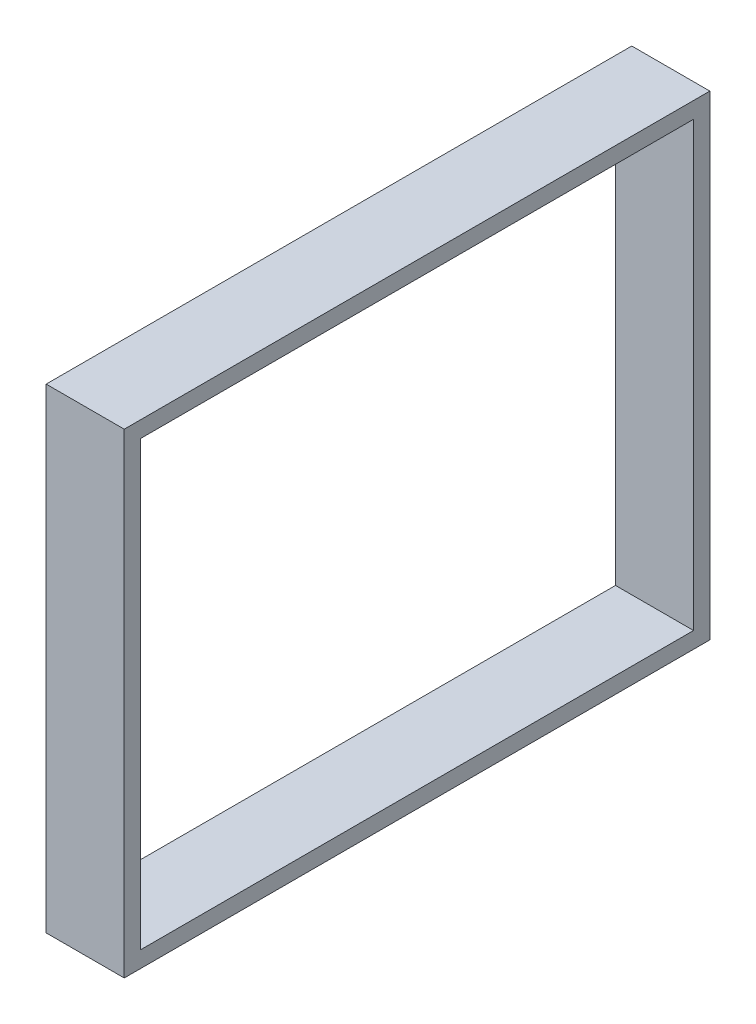
ISO-10303-21;
HEADER;
FILE_DESCRIPTION(('STEP AP214'),'2;1');
FILE_NAME('part.step','',(''),(''),'','','');
FILE_SCHEMA(('AUTOMOTIVE_DESIGN { 1 0 10303 214 1 1 1 1 }'));
ENDSEC;
DATA;
#1=APPLICATION_CONTEXT('core data for automotive mechanical design processes');
#2=APPLICATION_PROTOCOL_DEFINITION('international standard','automotive_design',2000,#1);
#3=PRODUCT_CONTEXT('',#1,'mechanical');
#4=PRODUCT('Part','Part','',(#3));
#5=PRODUCT_RELATED_PRODUCT_CATEGORY('part','',(#4));
#6=PRODUCT_DEFINITION_FORMATION('','',#4);
#7=PRODUCT_DEFINITION_CONTEXT('part definition',#1,'design');
#8=PRODUCT_DEFINITION('design','',#6,#7);
#9=PRODUCT_DEFINITION_SHAPE('','',#8);
#10=(LENGTH_UNIT() NAMED_UNIT(*) SI_UNIT(.MILLI.,.METRE.));
#11=(NAMED_UNIT(*) PLANE_ANGLE_UNIT() SI_UNIT($,.RADIAN.));
#12=(NAMED_UNIT(*) SI_UNIT($,.STERADIAN.) SOLID_ANGLE_UNIT());
#13=UNCERTAINTY_MEASURE_WITH_UNIT(LENGTH_MEASURE(1.E-05),#10,'distance_accuracy_value','');
#14=(GEOMETRIC_REPRESENTATION_CONTEXT(3) GLOBAL_UNCERTAINTY_ASSIGNED_CONTEXT((#13)) GLOBAL_UNIT_ASSIGNED_CONTEXT((#10,
#11,#12)) REPRESENTATION_CONTEXT('',''));
#15=CARTESIAN_POINT('',(0.,0.,0.));
#16=DIRECTION('',(0.,0.,1.));
#17=DIRECTION('',(1.,0.,0.));
#18=AXIS2_PLACEMENT_3D('',#15,#16,#17);
#19=CARTESIAN_POINT('',(2.4,0.,0.));
#20=DIRECTION('',(1.,0.,0.));
#21=DIRECTION('',(0.,0.,-1.));
#22=AXIS2_PLACEMENT_3D('',#19,#20,#21);
#23=PLANE('',#22);
#24=DIRECTION('',(0.,0.,-1.));
#25=VECTOR('',#24,1.);
#26=CARTESIAN_POINT('',(2.4,67.55,18.));
#27=LINE('',#26,#25);
#28=CARTESIAN_POINT('',(2.4,67.55,18.));
#29=VERTEX_POINT('',#28);
#30=CARTESIAN_POINT('',(2.4,67.55,-18.));
#31=VERTEX_POINT('',#30);
#32=EDGE_CURVE('E145',#29,#31,#27,.T.);
#33=ORIENTED_EDGE('',*,*,#32,.T.);
#34=DIRECTION('',(0.,1.,0.));
#35=VECTOR('',#34,1.);
#36=CARTESIAN_POINT('',(2.4,67.55,-18.));
#37=LINE('',#36,#35);
#38=CARTESIAN_POINT('',(2.4,96.77,-18.));
#39=VERTEX_POINT('',#38);
#40=EDGE_CURVE('E144',#31,#39,#37,.T.);
#41=ORIENTED_EDGE('',*,*,#40,.T.);
#42=DIRECTION('',(0.,0.,1.));
#43=VECTOR('',#42,1.);
#44=CARTESIAN_POINT('',(2.4,96.77,-18.));
#45=LINE('',#44,#43);
#46=CARTESIAN_POINT('',(2.4,96.77,18.));
#47=VERTEX_POINT('',#46);
#48=EDGE_CURVE('E149',#39,#47,#45,.T.);
#49=ORIENTED_EDGE('',*,*,#48,.T.);
#50=DIRECTION('',(0.,-1.,0.));
#51=VECTOR('',#50,1.);
#52=CARTESIAN_POINT('',(2.4,96.77,18.));
#53=LINE('',#52,#51);
#54=EDGE_CURVE('E148',#47,#29,#53,.T.);
#55=ORIENTED_EDGE('',*,*,#54,.T.);
#56=EDGE_LOOP('',(#33,#41,#49,#55));
#57=FACE_BOUND('',#56,.T.);
#58=DIRECTION('',(0.,1.,0.));
#59=VECTOR('',#58,1.);
#60=CARTESIAN_POINT('',(2.4,68.55,-17.));
#61=LINE('',#60,#59);
#62=CARTESIAN_POINT('',(2.4,68.55,-17.));
#63=VERTEX_POINT('',#62);
#64=CARTESIAN_POINT('',(2.4,95.77,-17.));
#65=VERTEX_POINT('',#64);
#66=EDGE_CURVE('E114',#63,#65,#61,.T.);
#67=ORIENTED_EDGE('',*,*,#66,.F.);
#68=DIRECTION('',(0.,0.,-1.));
#69=VECTOR('',#68,1.);
#70=CARTESIAN_POINT('',(2.4,68.55,17.));
#71=LINE('',#70,#69);
#72=CARTESIAN_POINT('',(2.4,68.55,17.));
#73=VERTEX_POINT('',#72);
#74=EDGE_CURVE('E107',#73,#63,#71,.T.);
#75=ORIENTED_EDGE('',*,*,#74,.F.);
#76=DIRECTION('',(0.,-1.,0.));
#77=VECTOR('',#76,1.);
#78=CARTESIAN_POINT('',(2.4,95.77,17.));
#79=LINE('',#78,#77);
#80=CARTESIAN_POINT('',(2.4,95.77,17.));
#81=VERTEX_POINT('',#80);
#82=EDGE_CURVE('E126',#81,#73,#79,.T.);
#83=ORIENTED_EDGE('',*,*,#82,.F.);
#84=DIRECTION('',(0.,0.,1.));
#85=VECTOR('',#84,1.);
#86=CARTESIAN_POINT('',(2.4,95.77,-17.));
#87=LINE('',#86,#85);
#88=EDGE_CURVE('E128',#65,#81,#87,.T.);
#89=ORIENTED_EDGE('',*,*,#88,.F.);
#90=EDGE_LOOP('',(#67,#75,#83,#89));
#91=FACE_BOUND('',#90,.T.);
#92=ADVANCED_FACE('F41',(#57,#91),#23,.T.);
#93=CARTESIAN_POINT('',(-2.4,0.,0.));
#94=DIRECTION('',(1.,0.,0.));
#95=DIRECTION('',(0.,0.,-1.));
#96=AXIS2_PLACEMENT_3D('',#93,#94,#95);
#97=PLANE('',#96);
#98=DIRECTION('',(0.,0.,-1.));
#99=VECTOR('',#98,1.);
#100=CARTESIAN_POINT('',(-2.4,67.55,18.));
#101=LINE('',#100,#99);
#102=CARTESIAN_POINT('',(-2.4,67.55,18.));
#103=VERTEX_POINT('',#102);
#104=CARTESIAN_POINT('',(-2.4,67.55,-18.));
#105=VERTEX_POINT('',#104);
#106=EDGE_CURVE('E122',#103,#105,#101,.T.);
#107=ORIENTED_EDGE('',*,*,#106,.F.);
#108=DIRECTION('',(0.,-1.,0.));
#109=VECTOR('',#108,1.);
#110=CARTESIAN_POINT('',(-2.4,96.77,18.));
#111=LINE('',#110,#109);
#112=CARTESIAN_POINT('',(-2.4,96.77,18.));
#113=VERTEX_POINT('',#112);
#114=EDGE_CURVE('E147',#113,#103,#111,.T.);
#115=ORIENTED_EDGE('',*,*,#114,.F.);
#116=DIRECTION('',(0.,0.,1.));
#117=VECTOR('',#116,1.);
#118=CARTESIAN_POINT('',(-2.4,96.77,-18.));
#119=LINE('',#118,#117);
#120=CARTESIAN_POINT('',(-2.4,96.77,-18.));
#121=VERTEX_POINT('',#120);
#122=EDGE_CURVE('E160',#121,#113,#119,.T.);
#123=ORIENTED_EDGE('',*,*,#122,.F.);
#124=DIRECTION('',(0.,1.,0.));
#125=VECTOR('',#124,1.);
#126=CARTESIAN_POINT('',(-2.4,67.55,-18.));
#127=LINE('',#126,#125);
#128=EDGE_CURVE('E151',#105,#121,#127,.T.);
#129=ORIENTED_EDGE('',*,*,#128,.F.);
#130=EDGE_LOOP('',(#107,#115,#123,#129));
#131=FACE_BOUND('',#130,.T.);
#132=DIRECTION('',(0.,0.,-1.));
#133=VECTOR('',#132,1.);
#134=CARTESIAN_POINT('',(-2.4,68.55,17.));
#135=LINE('',#134,#133);
#136=CARTESIAN_POINT('',(-2.4,68.55,17.));
#137=VERTEX_POINT('',#136);
#138=CARTESIAN_POINT('',(-2.4,68.55,-17.));
#139=VERTEX_POINT('',#138);
#140=EDGE_CURVE('E64',#137,#139,#135,.T.);
#141=ORIENTED_EDGE('',*,*,#140,.T.);
#142=DIRECTION('',(0.,1.,0.));
#143=VECTOR('',#142,1.);
#144=CARTESIAN_POINT('',(-2.4,68.55,-17.));
#145=LINE('',#144,#143);
#146=CARTESIAN_POINT('',(-2.4,95.77,-17.));
#147=VERTEX_POINT('',#146);
#148=EDGE_CURVE('E123',#139,#147,#145,.T.);
#149=ORIENTED_EDGE('',*,*,#148,.T.);
#150=DIRECTION('',(0.,0.,1.));
#151=VECTOR('',#150,1.);
#152=CARTESIAN_POINT('',(-2.4,95.77,-17.));
#153=LINE('',#152,#151);
#154=CARTESIAN_POINT('',(-2.4,95.77,17.));
#155=VERTEX_POINT('',#154);
#156=EDGE_CURVE('E132',#147,#155,#153,.T.);
#157=ORIENTED_EDGE('',*,*,#156,.T.);
#158=DIRECTION('',(0.,-1.,0.));
#159=VECTOR('',#158,1.);
#160=CARTESIAN_POINT('',(-2.4,95.77,17.));
#161=LINE('',#160,#159);
#162=EDGE_CURVE('E113',#155,#137,#161,.T.);
#163=ORIENTED_EDGE('',*,*,#162,.T.);
#164=EDGE_LOOP('',(#141,#149,#157,#163));
#165=FACE_BOUND('',#164,.T.);
#166=ADVANCED_FACE('F172',(#131,#165),#97,.F.);
#167=CARTESIAN_POINT('',(2.4,67.55,18.));
#168=DIRECTION('',(0.,1.,0.));
#169=DIRECTION('',(0.,0.,1.));
#170=AXIS2_PLACEMENT_3D('',#167,#168,#169);
#171=PLANE('',#170);
#172=ORIENTED_EDGE('',*,*,#106,.T.);
#173=DIRECTION('',(-1.,0.,0.));
#174=VECTOR('',#173,1.);
#175=CARTESIAN_POINT('',(2.4,67.55,-18.));
#176=LINE('',#175,#174);
#177=EDGE_CURVE('E11',#31,#105,#176,.T.);
#178=ORIENTED_EDGE('',*,*,#177,.F.);
#179=ORIENTED_EDGE('',*,*,#32,.F.);
#180=DIRECTION('',(-1.,0.,0.));
#181=VECTOR('',#180,1.);
#182=CARTESIAN_POINT('',(2.4,67.55,18.));
#183=LINE('',#182,#181);
#184=EDGE_CURVE('E155',#29,#103,#183,.T.);
#185=ORIENTED_EDGE('',*,*,#184,.T.);
#186=EDGE_LOOP('',(#172,#178,#179,#185));
#187=FACE_BOUND('',#186,.T.);
#188=ADVANCED_FACE('F43',(#187),#171,.F.);
#189=CARTESIAN_POINT('',(2.4,67.55,-18.));
#190=DIRECTION('',(0.,0.,1.));
#191=DIRECTION('',(1.,0.,0.));
#192=AXIS2_PLACEMENT_3D('',#189,#190,#191);
#193=PLANE('',#192);
#194=ORIENTED_EDGE('',*,*,#128,.T.);
#195=DIRECTION('',(-1.,0.,0.));
#196=VECTOR('',#195,1.);
#197=CARTESIAN_POINT('',(2.4,96.77,-18.));
#198=LINE('',#197,#196);
#199=EDGE_CURVE('E47',#39,#121,#198,.T.);
#200=ORIENTED_EDGE('',*,*,#199,.F.);
#201=ORIENTED_EDGE('',*,*,#40,.F.);
#202=ORIENTED_EDGE('',*,*,#177,.T.);
#203=EDGE_LOOP('',(#194,#200,#201,#202));
#204=FACE_BOUND('',#203,.T.);
#205=ADVANCED_FACE('F184',(#204),#193,.F.);
#206=CARTESIAN_POINT('',(2.4,96.77,-18.));
#207=DIRECTION('',(0.,-1.,0.));
#208=DIRECTION('',(0.,0.,-1.));
#209=AXIS2_PLACEMENT_3D('',#206,#207,#208);
#210=PLANE('',#209);
#211=ORIENTED_EDGE('',*,*,#122,.T.);
#212=DIRECTION('',(-1.,0.,0.));
#213=VECTOR('',#212,1.);
#214=CARTESIAN_POINT('',(2.4,96.77,18.));
#215=LINE('',#214,#213);
#216=EDGE_CURVE('E165',#47,#113,#215,.T.);
#217=ORIENTED_EDGE('',*,*,#216,.F.);
#218=ORIENTED_EDGE('',*,*,#48,.F.);
#219=ORIENTED_EDGE('',*,*,#199,.T.);
#220=EDGE_LOOP('',(#211,#217,#218,#219));
#221=FACE_BOUND('',#220,.T.);
#222=ADVANCED_FACE('F170',(#221),#210,.F.);
#223=CARTESIAN_POINT('',(2.4,96.77,18.));
#224=DIRECTION('',(0.,0.,-1.));
#225=DIRECTION('',(-1.,0.,0.));
#226=AXIS2_PLACEMENT_3D('',#223,#224,#225);
#227=PLANE('',#226);
#228=ORIENTED_EDGE('',*,*,#114,.T.);
#229=ORIENTED_EDGE('',*,*,#184,.F.);
#230=ORIENTED_EDGE('',*,*,#54,.F.);
#231=ORIENTED_EDGE('',*,*,#216,.T.);
#232=EDGE_LOOP('',(#228,#229,#230,#231));
#233=FACE_BOUND('',#232,.T.);
#234=ADVANCED_FACE('F177',(#233),#227,.F.);
#235=CARTESIAN_POINT('',(2.4,68.55,17.));
#236=DIRECTION('',(0.,1.,0.));
#237=DIRECTION('',(0.,0.,1.));
#238=AXIS2_PLACEMENT_3D('',#235,#236,#237);
#239=PLANE('',#238);
#240=ORIENTED_EDGE('',*,*,#140,.F.);
#241=DIRECTION('',(-1.,0.,0.));
#242=VECTOR('',#241,1.);
#243=CARTESIAN_POINT('',(2.4,68.55,17.));
#244=LINE('',#243,#242);
#245=EDGE_CURVE('E106',#73,#137,#244,.T.);
#246=ORIENTED_EDGE('',*,*,#245,.F.);
#247=ORIENTED_EDGE('',*,*,#74,.T.);
#248=DIRECTION('',(-1.,0.,0.));
#249=VECTOR('',#248,1.);
#250=CARTESIAN_POINT('',(2.4,68.55,-17.));
#251=LINE('',#250,#249);
#252=EDGE_CURVE('E109',#63,#139,#251,.T.);
#253=ORIENTED_EDGE('',*,*,#252,.T.);
#254=EDGE_LOOP('',(#240,#246,#247,#253));
#255=FACE_BOUND('',#254,.T.);
#256=ADVANCED_FACE('F108',(#255),#239,.T.);
#257=CARTESIAN_POINT('',(2.4,68.55,-17.));
#258=DIRECTION('',(0.,0.,1.));
#259=DIRECTION('',(1.,0.,0.));
#260=AXIS2_PLACEMENT_3D('',#257,#258,#259);
#261=PLANE('',#260);
#262=ORIENTED_EDGE('',*,*,#148,.F.);
#263=ORIENTED_EDGE('',*,*,#252,.F.);
#264=ORIENTED_EDGE('',*,*,#66,.T.);
#265=DIRECTION('',(-1.,0.,0.));
#266=VECTOR('',#265,1.);
#267=CARTESIAN_POINT('',(2.4,95.77,-17.));
#268=LINE('',#267,#266);
#269=EDGE_CURVE('E121',#65,#147,#268,.T.);
#270=ORIENTED_EDGE('',*,*,#269,.T.);
#271=EDGE_LOOP('',(#262,#263,#264,#270));
#272=FACE_BOUND('',#271,.T.);
#273=ADVANCED_FACE('F118',(#272),#261,.T.);
#274=CARTESIAN_POINT('',(2.4,95.77,-17.));
#275=DIRECTION('',(0.,-1.,0.));
#276=DIRECTION('',(0.,0.,-1.));
#277=AXIS2_PLACEMENT_3D('',#274,#275,#276);
#278=PLANE('',#277);
#279=ORIENTED_EDGE('',*,*,#156,.F.);
#280=ORIENTED_EDGE('',*,*,#269,.F.);
#281=ORIENTED_EDGE('',*,*,#88,.T.);
#282=DIRECTION('',(-1.,0.,0.));
#283=VECTOR('',#282,1.);
#284=CARTESIAN_POINT('',(2.4,95.77,17.));
#285=LINE('',#284,#283);
#286=EDGE_CURVE('E57',#81,#155,#285,.T.);
#287=ORIENTED_EDGE('',*,*,#286,.T.);
#288=EDGE_LOOP('',(#279,#280,#281,#287));
#289=FACE_BOUND('',#288,.T.);
#290=ADVANCED_FACE('F208',(#289),#278,.T.);
#291=CARTESIAN_POINT('',(2.4,95.77,17.));
#292=DIRECTION('',(0.,0.,-1.));
#293=DIRECTION('',(-1.,0.,0.));
#294=AXIS2_PLACEMENT_3D('',#291,#292,#293);
#295=PLANE('',#294);
#296=ORIENTED_EDGE('',*,*,#162,.F.);
#297=ORIENTED_EDGE('',*,*,#286,.F.);
#298=ORIENTED_EDGE('',*,*,#82,.T.);
#299=ORIENTED_EDGE('',*,*,#245,.T.);
#300=EDGE_LOOP('',(#296,#297,#298,#299));
#301=FACE_BOUND('',#300,.T.);
#302=ADVANCED_FACE('F212',(#301),#295,.T.);
#303=CLOSED_SHELL('',(#92,#166,#188,#205,#222,#234,#256,#273,#290,#302));
#304=MANIFOLD_SOLID_BREP('B2',#303);
#305=ADVANCED_BREP_SHAPE_REPRESENTATION('',(#18,#304),#14);
#306=SHAPE_DEFINITION_REPRESENTATION(#9,#305);
ENDSEC;
END-ISO-10303-21;
